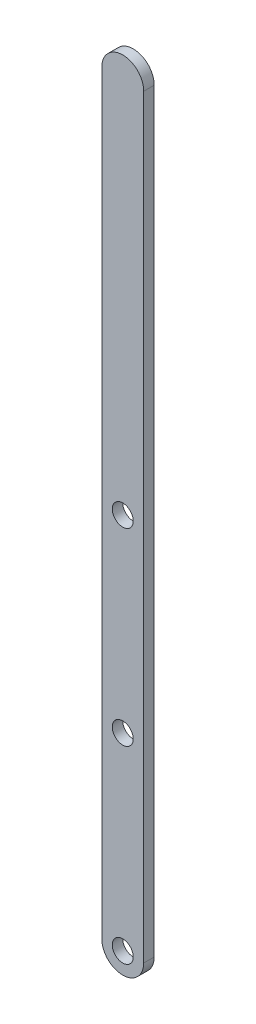
ISO-10303-21;
HEADER;
FILE_DESCRIPTION(('STEP AP214'),'2;1');
FILE_NAME('part.step','',(''),(''),'','','');
FILE_SCHEMA(('AUTOMOTIVE_DESIGN { 1 0 10303 214 1 1 1 1 }'));
ENDSEC;
DATA;
#1=APPLICATION_CONTEXT('core data for automotive mechanical design processes');
#2=APPLICATION_PROTOCOL_DEFINITION('international standard','automotive_design',2000,#1);
#3=PRODUCT_CONTEXT('',#1,'mechanical');
#4=PRODUCT('Part','Part','',(#3));
#5=PRODUCT_RELATED_PRODUCT_CATEGORY('part','',(#4));
#6=PRODUCT_DEFINITION_FORMATION('','',#4);
#7=PRODUCT_DEFINITION_CONTEXT('part definition',#1,'design');
#8=PRODUCT_DEFINITION('design','',#6,#7);
#9=PRODUCT_DEFINITION_SHAPE('','',#8);
#10=(LENGTH_UNIT() NAMED_UNIT(*) SI_UNIT(.MILLI.,.METRE.));
#11=(NAMED_UNIT(*) PLANE_ANGLE_UNIT() SI_UNIT($,.RADIAN.));
#12=(NAMED_UNIT(*) SI_UNIT($,.STERADIAN.) SOLID_ANGLE_UNIT());
#13=UNCERTAINTY_MEASURE_WITH_UNIT(LENGTH_MEASURE(1.E-05),#10,'distance_accuracy_value','');
#14=(GEOMETRIC_REPRESENTATION_CONTEXT(3) GLOBAL_UNCERTAINTY_ASSIGNED_CONTEXT((#13)) GLOBAL_UNIT_ASSIGNED_CONTEXT((#10,
#11,#12)) REPRESENTATION_CONTEXT('',''));
#15=CARTESIAN_POINT('',(0.,0.,0.));
#16=DIRECTION('',(0.,0.,1.));
#17=DIRECTION('',(1.,0.,0.));
#18=AXIS2_PLACEMENT_3D('',#15,#16,#17);
#19=CARTESIAN_POINT('',(0.,-457.2,12.7));
#20=DIRECTION('',(0.,0.,1.));
#21=DIRECTION('',(1.,0.,0.));
#22=AXIS2_PLACEMENT_3D('',#19,#20,#21);
#23=PLANE('',#22);
#24=CARTESIAN_POINT('',(0.,-457.2,12.7));
#25=DIRECTION('',(0.,0.,1.));
#26=DIRECTION('',(1.,0.,0.));
#27=AXIS2_PLACEMENT_3D('',#24,#25,#26);
#28=CIRCLE('',#27,12.7);
#29=CARTESIAN_POINT('',(12.7,-457.2,12.7));
#30=VERTEX_POINT('',#29);
#31=EDGE_CURVE('E118',#30,#30,#28,.T.);
#32=ORIENTED_EDGE('',*,*,#31,.F.);
#33=EDGE_LOOP('',(#32));
#34=FACE_BOUND('',#33,.T.);
#35=CARTESIAN_POINT('',(0.,-457.2,12.7));
#36=DIRECTION('',(0.,0.,1.));
#37=DIRECTION('',(1.,0.,0.));
#38=AXIS2_PLACEMENT_3D('',#35,#36,#37);
#39=CIRCLE('',#38,25.3999999999999);
#40=CARTESIAN_POINT('',(-25.3999999999999,-457.2,12.7));
#41=VERTEX_POINT('',#40);
#42=CARTESIAN_POINT('',(25.3999999999999,-457.2,12.7));
#43=VERTEX_POINT('',#42);
#44=EDGE_CURVE('E89',#41,#43,#39,.T.);
#45=ORIENTED_EDGE('',*,*,#44,.T.);
#46=DIRECTION('',(0.,1.,0.));
#47=VECTOR('',#46,1.);
#48=CARTESIAN_POINT('',(25.3999999999999,0.,12.7));
#49=LINE('',#48,#47);
#50=CARTESIAN_POINT('',(25.3999999999999,457.2,12.7));
#51=VERTEX_POINT('',#50);
#52=EDGE_CURVE('E83',#43,#51,#49,.T.);
#53=ORIENTED_EDGE('',*,*,#52,.T.);
#54=CARTESIAN_POINT('',(0.,457.2,12.7));
#55=DIRECTION('',(0.,0.,1.));
#56=DIRECTION('',(1.,0.,0.));
#57=AXIS2_PLACEMENT_3D('',#54,#55,#56);
#58=CIRCLE('',#57,25.3999999999999);
#59=CARTESIAN_POINT('',(-25.3999999999999,457.2,12.7));
#60=VERTEX_POINT('',#59);
#61=EDGE_CURVE('E86',#51,#60,#58,.T.);
#62=ORIENTED_EDGE('',*,*,#61,.T.);
#63=DIRECTION('',(0.,-1.,0.));
#64=VECTOR('',#63,1.);
#65=CARTESIAN_POINT('',(-25.3999999999999,0.,12.7));
#66=LINE('',#65,#64);
#67=EDGE_CURVE('E55',#60,#41,#66,.T.);
#68=ORIENTED_EDGE('',*,*,#67,.T.);
#69=EDGE_LOOP('',(#45,#53,#62,#68));
#70=FACE_BOUND('',#69,.T.);
#71=CARTESIAN_POINT('',(0.,0.,12.7));
#72=DIRECTION('',(0.,0.,1.));
#73=DIRECTION('',(1.,0.,0.));
#74=AXIS2_PLACEMENT_3D('',#71,#72,#73);
#75=CIRCLE('',#74,12.7);
#76=CARTESIAN_POINT('',(12.7,0.,12.7));
#77=VERTEX_POINT('',#76);
#78=EDGE_CURVE('E106',#77,#77,#75,.T.);
#79=ORIENTED_EDGE('',*,*,#78,.F.);
#80=EDGE_LOOP('',(#79));
#81=FACE_BOUND('',#80,.T.);
#82=CARTESIAN_POINT('',(0.,-228.6,12.7));
#83=DIRECTION('',(0.,0.,1.));
#84=DIRECTION('',(1.,0.,0.));
#85=AXIS2_PLACEMENT_3D('',#82,#83,#84);
#86=CIRCLE('',#85,12.7);
#87=CARTESIAN_POINT('',(12.7,-228.6,12.7));
#88=VERTEX_POINT('',#87);
#89=EDGE_CURVE('E124',#88,#88,#86,.T.);
#90=ORIENTED_EDGE('',*,*,#89,.F.);
#91=EDGE_LOOP('',(#90));
#92=FACE_BOUND('',#91,.T.);
#93=ADVANCED_FACE('F38',(#34,#70,#81,#92),#23,.T.);
#94=CARTESIAN_POINT('',(0.,-457.2,0.));
#95=DIRECTION('',(0.,0.,1.));
#96=DIRECTION('',(1.,0.,0.));
#97=AXIS2_PLACEMENT_3D('',#94,#95,#96);
#98=PLANE('',#97);
#99=CARTESIAN_POINT('',(0.,-457.2,0.));
#100=DIRECTION('',(0.,0.,1.));
#101=DIRECTION('',(1.,0.,0.));
#102=AXIS2_PLACEMENT_3D('',#99,#100,#101);
#103=CIRCLE('',#102,25.3999999999999);
#104=CARTESIAN_POINT('',(-25.3999999999999,-457.2,0.));
#105=VERTEX_POINT('',#104);
#106=CARTESIAN_POINT('',(25.3999999999999,-457.2,0.));
#107=VERTEX_POINT('',#106);
#108=EDGE_CURVE('E103',#105,#107,#103,.T.);
#109=ORIENTED_EDGE('',*,*,#108,.F.);
#110=DIRECTION('',(0.,-1.,0.));
#111=VECTOR('',#110,1.);
#112=CARTESIAN_POINT('',(-25.3999999999999,-457.2,0.));
#113=LINE('',#112,#111);
#114=CARTESIAN_POINT('',(-25.3999999999999,457.2,0.));
#115=VERTEX_POINT('',#114);
#116=EDGE_CURVE('E72',#115,#105,#113,.T.);
#117=ORIENTED_EDGE('',*,*,#116,.F.);
#118=CARTESIAN_POINT('',(0.,457.2,0.));
#119=DIRECTION('',(0.,0.,1.));
#120=DIRECTION('',(1.,0.,0.));
#121=AXIS2_PLACEMENT_3D('',#118,#119,#120);
#122=CIRCLE('',#121,25.3999999999999);
#123=CARTESIAN_POINT('',(25.3999999999999,457.2,0.));
#124=VERTEX_POINT('',#123);
#125=EDGE_CURVE('E108',#124,#115,#122,.T.);
#126=ORIENTED_EDGE('',*,*,#125,.F.);
#127=DIRECTION('',(0.,1.,0.));
#128=VECTOR('',#127,1.);
#129=CARTESIAN_POINT('',(25.3999999999999,0.,0.));
#130=LINE('',#129,#128);
#131=EDGE_CURVE('E94',#107,#124,#130,.T.);
#132=ORIENTED_EDGE('',*,*,#131,.F.);
#133=EDGE_LOOP('',(#109,#117,#126,#132));
#134=FACE_BOUND('',#133,.T.);
#135=CARTESIAN_POINT('',(0.,0.,0.));
#136=DIRECTION('',(0.,0.,1.));
#137=DIRECTION('',(1.,0.,0.));
#138=AXIS2_PLACEMENT_3D('',#135,#136,#137);
#139=CIRCLE('',#138,12.7);
#140=CARTESIAN_POINT('',(12.7,0.,0.));
#141=VERTEX_POINT('',#140);
#142=EDGE_CURVE('E115',#141,#141,#139,.T.);
#143=ORIENTED_EDGE('',*,*,#142,.T.);
#144=EDGE_LOOP('',(#143));
#145=FACE_BOUND('',#144,.T.);
#146=CARTESIAN_POINT('',(0.,-457.2,0.));
#147=DIRECTION('',(0.,0.,1.));
#148=DIRECTION('',(1.,0.,0.));
#149=AXIS2_PLACEMENT_3D('',#146,#147,#148);
#150=CIRCLE('',#149,12.7);
#151=CARTESIAN_POINT('',(12.7,-457.2,0.));
#152=VERTEX_POINT('',#151);
#153=EDGE_CURVE('E121',#152,#152,#150,.T.);
#154=ORIENTED_EDGE('',*,*,#153,.T.);
#155=EDGE_LOOP('',(#154));
#156=FACE_BOUND('',#155,.T.);
#157=CARTESIAN_POINT('',(0.,-228.6,0.));
#158=DIRECTION('',(0.,0.,1.));
#159=DIRECTION('',(1.,0.,0.));
#160=AXIS2_PLACEMENT_3D('',#157,#158,#159);
#161=CIRCLE('',#160,12.7);
#162=CARTESIAN_POINT('',(12.7,-228.6,0.));
#163=VERTEX_POINT('',#162);
#164=EDGE_CURVE('E127',#163,#163,#161,.T.);
#165=ORIENTED_EDGE('',*,*,#164,.T.);
#166=EDGE_LOOP('',(#165));
#167=FACE_BOUND('',#166,.T.);
#168=ADVANCED_FACE('F137',(#134,#145,#156,#167),#98,.F.);
#169=CARTESIAN_POINT('',(0.,-457.2,12.7));
#170=DIRECTION('',(0.,0.,-1.));
#171=DIRECTION('',(-1.,0.,0.));
#172=AXIS2_PLACEMENT_3D('',#169,#170,#171);
#173=CYLINDRICAL_SURFACE('',#172,25.3999999999999);
#174=ORIENTED_EDGE('',*,*,#108,.T.);
#175=DIRECTION('',(0.,0.,-1.));
#176=VECTOR('',#175,1.);
#177=CARTESIAN_POINT('',(25.3999999999999,-457.2,12.7));
#178=LINE('',#177,#176);
#179=EDGE_CURVE('E11',#43,#107,#178,.T.);
#180=ORIENTED_EDGE('',*,*,#179,.F.);
#181=ORIENTED_EDGE('',*,*,#44,.F.);
#182=DIRECTION('',(0.,0.,-1.));
#183=VECTOR('',#182,1.);
#184=CARTESIAN_POINT('',(-25.3999999999999,-457.2,12.7));
#185=LINE('',#184,#183);
#186=EDGE_CURVE('E99',#41,#105,#185,.T.);
#187=ORIENTED_EDGE('',*,*,#186,.T.);
#188=EDGE_LOOP('',(#174,#180,#181,#187));
#189=FACE_BOUND('',#188,.T.);
#190=ADVANCED_FACE('F40',(#189),#173,.T.);
#191=CARTESIAN_POINT('',(25.3999999999999,0.,12.7));
#192=DIRECTION('',(-1.,0.,0.));
#193=DIRECTION('',(0.,-1.,0.));
#194=AXIS2_PLACEMENT_3D('',#191,#192,#193);
#195=PLANE('',#194);
#196=ORIENTED_EDGE('',*,*,#131,.T.);
#197=DIRECTION('',(0.,0.,-1.));
#198=VECTOR('',#197,1.);
#199=CARTESIAN_POINT('',(25.3999999999999,457.2,12.7));
#200=LINE('',#199,#198);
#201=EDGE_CURVE('E47',#51,#124,#200,.T.);
#202=ORIENTED_EDGE('',*,*,#201,.F.);
#203=ORIENTED_EDGE('',*,*,#52,.F.);
#204=ORIENTED_EDGE('',*,*,#179,.T.);
#205=EDGE_LOOP('',(#196,#202,#203,#204));
#206=FACE_BOUND('',#205,.T.);
#207=ADVANCED_FACE('F93',(#206),#195,.F.);
#208=CARTESIAN_POINT('',(0.,457.2,12.7));
#209=DIRECTION('',(0.,0.,-1.));
#210=DIRECTION('',(-1.,0.,0.));
#211=AXIS2_PLACEMENT_3D('',#208,#209,#210);
#212=CYLINDRICAL_SURFACE('',#211,25.3999999999999);
#213=ORIENTED_EDGE('',*,*,#125,.T.);
#214=DIRECTION('',(0.,0.,-1.));
#215=VECTOR('',#214,1.);
#216=CARTESIAN_POINT('',(-25.3999999999999,457.2,12.7));
#217=LINE('',#216,#215);
#218=EDGE_CURVE('E96',#60,#115,#217,.T.);
#219=ORIENTED_EDGE('',*,*,#218,.F.);
#220=ORIENTED_EDGE('',*,*,#61,.F.);
#221=ORIENTED_EDGE('',*,*,#201,.T.);
#222=EDGE_LOOP('',(#213,#219,#220,#221));
#223=FACE_BOUND('',#222,.T.);
#224=ADVANCED_FACE('F97',(#223),#212,.T.);
#225=CARTESIAN_POINT('',(-25.3999999999999,-457.2,12.7));
#226=DIRECTION('',(1.,0.,0.));
#227=DIRECTION('',(0.,1.,0.));
#228=AXIS2_PLACEMENT_3D('',#225,#226,#227);
#229=PLANE('',#228);
#230=ORIENTED_EDGE('',*,*,#116,.T.);
#231=ORIENTED_EDGE('',*,*,#186,.F.);
#232=ORIENTED_EDGE('',*,*,#67,.F.);
#233=ORIENTED_EDGE('',*,*,#218,.T.);
#234=EDGE_LOOP('',(#230,#231,#232,#233));
#235=FACE_BOUND('',#234,.T.);
#236=ADVANCED_FACE('F112',(#235),#229,.F.);
#237=CARTESIAN_POINT('',(0.,0.,12.7));
#238=DIRECTION('',(0.,0.,-1.));
#239=DIRECTION('',(-1.,0.,0.));
#240=AXIS2_PLACEMENT_3D('',#237,#238,#239);
#241=CYLINDRICAL_SURFACE('',#240,12.7);
#242=ORIENTED_EDGE('',*,*,#78,.T.);
#243=EDGE_LOOP('',(#242));
#244=FACE_BOUND('',#243,.T.);
#245=ORIENTED_EDGE('',*,*,#142,.F.);
#246=EDGE_LOOP('',(#245));
#247=FACE_BOUND('',#246,.T.);
#248=ADVANCED_FACE('F146',(#244,#247),#241,.F.);
#249=CARTESIAN_POINT('',(0.,-457.2,12.7));
#250=DIRECTION('',(0.,0.,-1.));
#251=DIRECTION('',(-1.,0.,0.));
#252=AXIS2_PLACEMENT_3D('',#249,#250,#251);
#253=CYLINDRICAL_SURFACE('',#252,12.7);
#254=ORIENTED_EDGE('',*,*,#31,.T.);
#255=EDGE_LOOP('',(#254));
#256=FACE_BOUND('',#255,.T.);
#257=ORIENTED_EDGE('',*,*,#153,.F.);
#258=EDGE_LOOP('',(#257));
#259=FACE_BOUND('',#258,.T.);
#260=ADVANCED_FACE('F198',(#256,#259),#253,.F.);
#261=CARTESIAN_POINT('',(0.,-228.6,12.7));
#262=DIRECTION('',(0.,0.,-1.));
#263=DIRECTION('',(-1.,0.,0.));
#264=AXIS2_PLACEMENT_3D('',#261,#262,#263);
#265=CYLINDRICAL_SURFACE('',#264,12.7);
#266=ORIENTED_EDGE('',*,*,#89,.T.);
#267=EDGE_LOOP('',(#266));
#268=FACE_BOUND('',#267,.T.);
#269=ORIENTED_EDGE('',*,*,#164,.F.);
#270=EDGE_LOOP('',(#269));
#271=FACE_BOUND('',#270,.T.);
#272=ADVANCED_FACE('F133',(#268,#271),#265,.F.);
#273=CLOSED_SHELL('',(#93,#168,#190,#207,#224,#236,#248,#260,#272));
#274=MANIFOLD_SOLID_BREP('B2',#273);
#275=ADVANCED_BREP_SHAPE_REPRESENTATION('',(#18,#274),#14);
#276=SHAPE_DEFINITION_REPRESENTATION(#9,#275);
ENDSEC;
END-ISO-10303-21;
